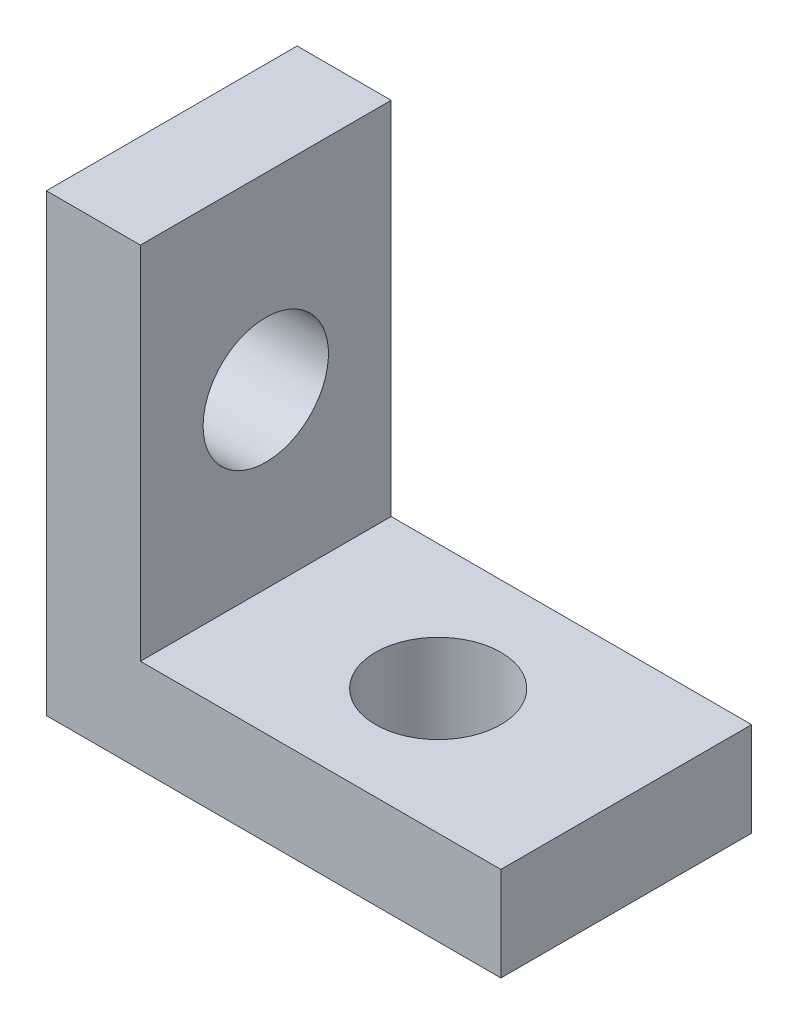
ISO-10303-21;
HEADER;
FILE_DESCRIPTION(('STEP AP214'),'2;1');
FILE_NAME('part.step','',(''),(''),'','','');
FILE_SCHEMA(('AUTOMOTIVE_DESIGN { 1 0 10303 214 1 1 1 1 }'));
ENDSEC;
DATA;
#1=APPLICATION_CONTEXT('core data for automotive mechanical design processes');
#2=APPLICATION_PROTOCOL_DEFINITION('international standard','automotive_design',2000,#1);
#3=PRODUCT_CONTEXT('',#1,'mechanical');
#4=PRODUCT('Part','Part','',(#3));
#5=PRODUCT_RELATED_PRODUCT_CATEGORY('part','',(#4));
#6=PRODUCT_DEFINITION_FORMATION('','',#4);
#7=PRODUCT_DEFINITION_CONTEXT('part definition',#1,'design');
#8=PRODUCT_DEFINITION('design','',#6,#7);
#9=PRODUCT_DEFINITION_SHAPE('','',#8);
#10=(LENGTH_UNIT() NAMED_UNIT(*) SI_UNIT(.MILLI.,.METRE.));
#11=(NAMED_UNIT(*) PLANE_ANGLE_UNIT() SI_UNIT($,.RADIAN.));
#12=(NAMED_UNIT(*) SI_UNIT($,.STERADIAN.) SOLID_ANGLE_UNIT());
#13=UNCERTAINTY_MEASURE_WITH_UNIT(LENGTH_MEASURE(1.E-05),#10,'distance_accuracy_value','');
#14=(GEOMETRIC_REPRESENTATION_CONTEXT(3) GLOBAL_UNCERTAINTY_ASSIGNED_CONTEXT((#13)) GLOBAL_UNIT_ASSIGNED_CONTEXT((#10,
#11,#12)) REPRESENTATION_CONTEXT('',''));
#15=CARTESIAN_POINT('',(0.,0.,0.));
#16=DIRECTION('',(0.,0.,1.));
#17=DIRECTION('',(1.,0.,0.));
#18=AXIS2_PLACEMENT_3D('',#15,#16,#17);
#19=CARTESIAN_POINT('',(0.,0.,8.));
#20=DIRECTION('',(1.,0.,0.));
#21=DIRECTION('',(0.,0.,-1.));
#22=AXIS2_PLACEMENT_3D('',#19,#20,#21);
#23=PLANE('',#22);
#24=CARTESIAN_POINT('',(0.,8.5,4.));
#25=DIRECTION('',(-1.,0.,0.));
#26=DIRECTION('',(0.,0.,1.));
#27=AXIS2_PLACEMENT_3D('',#24,#25,#26);
#28=CIRCLE('',#27,2.);
#29=CARTESIAN_POINT('',(0.,8.5,6.));
#30=VERTEX_POINT('',#29);
#31=EDGE_CURVE('E148',#30,#30,#28,.T.);
#32=ORIENTED_EDGE('',*,*,#31,.F.);
#33=EDGE_LOOP('',(#32));
#34=FACE_BOUND('',#33,.T.);
#35=DIRECTION('',(0.,-1.,0.));
#36=VECTOR('',#35,1.);
#37=CARTESIAN_POINT('',(0.,0.,0.));
#38=LINE('',#37,#36);
#39=CARTESIAN_POINT('',(0.,14.5,0.));
#40=VERTEX_POINT('',#39);
#41=CARTESIAN_POINT('',(0.,0.,0.));
#42=VERTEX_POINT('',#41);
#43=EDGE_CURVE('E123',#40,#42,#38,.T.);
#44=ORIENTED_EDGE('',*,*,#43,.T.);
#45=DIRECTION('',(0.,0.,-1.));
#46=VECTOR('',#45,1.);
#47=CARTESIAN_POINT('',(0.,0.,8.));
#48=LINE('',#47,#46);
#49=CARTESIAN_POINT('',(0.,0.,8.));
#50=VERTEX_POINT('',#49);
#51=EDGE_CURVE('E11',#50,#42,#48,.T.);
#52=ORIENTED_EDGE('',*,*,#51,.F.);
#53=DIRECTION('',(0.,-1.,0.));
#54=VECTOR('',#53,1.);
#55=CARTESIAN_POINT('',(0.,0.,8.));
#56=LINE('',#55,#54);
#57=CARTESIAN_POINT('',(0.,14.5,8.));
#58=VERTEX_POINT('',#57);
#59=EDGE_CURVE('E134',#58,#50,#56,.T.);
#60=ORIENTED_EDGE('',*,*,#59,.F.);
#61=DIRECTION('',(0.,0.,-1.));
#62=VECTOR('',#61,1.);
#63=CARTESIAN_POINT('',(0.,14.5,8.));
#64=LINE('',#63,#62);
#65=EDGE_CURVE('E119',#58,#40,#64,.T.);
#66=ORIENTED_EDGE('',*,*,#65,.T.);
#67=EDGE_LOOP('',(#44,#52,#60,#66));
#68=FACE_BOUND('',#67,.T.);
#69=ADVANCED_FACE('F37',(#34,#68),#23,.F.);
#70=CARTESIAN_POINT('',(0.,0.,8.));
#71=DIRECTION('',(0.,1.,0.));
#72=DIRECTION('',(0.,0.,1.));
#73=AXIS2_PLACEMENT_3D('',#70,#71,#72);
#74=PLANE('',#73);
#75=CARTESIAN_POINT('',(8.5,0.,4.));
#76=DIRECTION('',(0.,-1.,0.));
#77=DIRECTION('',(0.,0.,-1.));
#78=AXIS2_PLACEMENT_3D('',#75,#76,#77);
#79=CIRCLE('',#78,2.);
#80=CARTESIAN_POINT('',(8.5,0.,2.));
#81=VERTEX_POINT('',#80);
#82=EDGE_CURVE('E140',#81,#81,#79,.T.);
#83=ORIENTED_EDGE('',*,*,#82,.F.);
#84=EDGE_LOOP('',(#83));
#85=FACE_BOUND('',#84,.T.);
#86=DIRECTION('',(1.,0.,0.));
#87=VECTOR('',#86,1.);
#88=CARTESIAN_POINT('',(0.,0.,0.));
#89=LINE('',#88,#87);
#90=CARTESIAN_POINT('',(14.5,0.,0.));
#91=VERTEX_POINT('',#90);
#92=EDGE_CURVE('E126',#42,#91,#89,.T.);
#93=ORIENTED_EDGE('',*,*,#92,.T.);
#94=DIRECTION('',(0.,0.,-1.));
#95=VECTOR('',#94,1.);
#96=CARTESIAN_POINT('',(14.5,0.,8.));
#97=LINE('',#96,#95);
#98=CARTESIAN_POINT('',(14.5,0.,8.));
#99=VERTEX_POINT('',#98);
#100=EDGE_CURVE('E46',#99,#91,#97,.T.);
#101=ORIENTED_EDGE('',*,*,#100,.F.);
#102=DIRECTION('',(1.,0.,0.));
#103=VECTOR('',#102,1.);
#104=CARTESIAN_POINT('',(0.,0.,8.));
#105=LINE('',#104,#103);
#106=EDGE_CURVE('E92',#50,#99,#105,.T.);
#107=ORIENTED_EDGE('',*,*,#106,.F.);
#108=ORIENTED_EDGE('',*,*,#51,.T.);
#109=EDGE_LOOP('',(#93,#101,#107,#108));
#110=FACE_BOUND('',#109,.T.);
#111=ADVANCED_FACE('F154',(#85,#110),#74,.F.);
#112=CARTESIAN_POINT('',(14.5,0.,8.));
#113=DIRECTION('',(-1.,0.,0.));
#114=DIRECTION('',(0.,0.,1.));
#115=AXIS2_PLACEMENT_3D('',#112,#113,#114);
#116=PLANE('',#115);
#117=DIRECTION('',(0.,1.,0.));
#118=VECTOR('',#117,1.);
#119=CARTESIAN_POINT('',(14.5,0.,0.));
#120=LINE('',#119,#118);
#121=CARTESIAN_POINT('',(14.5,3.,0.));
#122=VERTEX_POINT('',#121);
#123=EDGE_CURVE('E129',#91,#122,#120,.T.);
#124=ORIENTED_EDGE('',*,*,#123,.T.);
#125=DIRECTION('',(0.,0.,-1.));
#126=VECTOR('',#125,1.);
#127=CARTESIAN_POINT('',(14.5,3.,8.));
#128=LINE('',#127,#126);
#129=CARTESIAN_POINT('',(14.5,3.,8.));
#130=VERTEX_POINT('',#129);
#131=EDGE_CURVE('E114',#130,#122,#128,.T.);
#132=ORIENTED_EDGE('',*,*,#131,.F.);
#133=DIRECTION('',(0.,1.,0.));
#134=VECTOR('',#133,1.);
#135=CARTESIAN_POINT('',(14.5,0.,8.));
#136=LINE('',#135,#134);
#137=EDGE_CURVE('E105',#99,#130,#136,.T.);
#138=ORIENTED_EDGE('',*,*,#137,.F.);
#139=ORIENTED_EDGE('',*,*,#100,.T.);
#140=EDGE_LOOP('',(#124,#132,#138,#139));
#141=FACE_BOUND('',#140,.T.);
#142=ADVANCED_FACE('F157',(#141),#116,.F.);
#143=CARTESIAN_POINT('',(14.5,3.,8.));
#144=DIRECTION('',(0.,-1.,0.));
#145=DIRECTION('',(0.,0.,-1.));
#146=AXIS2_PLACEMENT_3D('',#143,#144,#145);
#147=PLANE('',#146);
#148=CARTESIAN_POINT('',(8.5,3.,4.));
#149=DIRECTION('',(0.,-1.,0.));
#150=DIRECTION('',(0.,0.,-1.));
#151=AXIS2_PLACEMENT_3D('',#148,#149,#150);
#152=CIRCLE('',#151,2.);
#153=CARTESIAN_POINT('',(8.5,3.,2.));
#154=VERTEX_POINT('',#153);
#155=EDGE_CURVE('E127',#154,#154,#152,.T.);
#156=ORIENTED_EDGE('',*,*,#155,.T.);
#157=EDGE_LOOP('',(#156));
#158=FACE_BOUND('',#157,.T.);
#159=DIRECTION('',(-1.,0.,0.));
#160=VECTOR('',#159,1.);
#161=CARTESIAN_POINT('',(14.5,3.,0.));
#162=LINE('',#161,#160);
#163=CARTESIAN_POINT('',(3.,3.,0.));
#164=VERTEX_POINT('',#163);
#165=EDGE_CURVE('E113',#122,#164,#162,.T.);
#166=ORIENTED_EDGE('',*,*,#165,.T.);
#167=DIRECTION('',(0.,0.,-1.));
#168=VECTOR('',#167,1.);
#169=CARTESIAN_POINT('',(3.,3.,8.));
#170=LINE('',#169,#168);
#171=CARTESIAN_POINT('',(3.,3.,8.));
#172=VERTEX_POINT('',#171);
#173=EDGE_CURVE('E110',#172,#164,#170,.T.);
#174=ORIENTED_EDGE('',*,*,#173,.F.);
#175=DIRECTION('',(-1.,0.,0.));
#176=VECTOR('',#175,1.);
#177=CARTESIAN_POINT('',(14.5,3.,8.));
#178=LINE('',#177,#176);
#179=EDGE_CURVE('E99',#130,#172,#178,.T.);
#180=ORIENTED_EDGE('',*,*,#179,.F.);
#181=ORIENTED_EDGE('',*,*,#131,.T.);
#182=EDGE_LOOP('',(#166,#174,#180,#181));
#183=FACE_BOUND('',#182,.T.);
#184=ADVANCED_FACE('F111',(#158,#183),#147,.F.);
#185=CARTESIAN_POINT('',(3.,3.,8.));
#186=DIRECTION('',(-1.,0.,0.));
#187=DIRECTION('',(0.,0.,1.));
#188=AXIS2_PLACEMENT_3D('',#185,#186,#187);
#189=PLANE('',#188);
#190=CARTESIAN_POINT('',(3.,8.5,4.));
#191=DIRECTION('',(-1.,0.,0.));
#192=DIRECTION('',(0.,0.,1.));
#193=AXIS2_PLACEMENT_3D('',#190,#191,#192);
#194=CIRCLE('',#193,2.);
#195=CARTESIAN_POINT('',(3.,8.5,6.));
#196=VERTEX_POINT('',#195);
#197=EDGE_CURVE('E40',#196,#196,#194,.T.);
#198=ORIENTED_EDGE('',*,*,#197,.T.);
#199=EDGE_LOOP('',(#198));
#200=FACE_BOUND('',#199,.T.);
#201=DIRECTION('',(0.,1.,0.));
#202=VECTOR('',#201,1.);
#203=CARTESIAN_POINT('',(3.,3.,0.));
#204=LINE('',#203,#202);
#205=CARTESIAN_POINT('',(3.,14.5,0.));
#206=VERTEX_POINT('',#205);
#207=EDGE_CURVE('E78',#164,#206,#204,.T.);
#208=ORIENTED_EDGE('',*,*,#207,.T.);
#209=DIRECTION('',(0.,0.,-1.));
#210=VECTOR('',#209,1.);
#211=CARTESIAN_POINT('',(3.,14.5,8.));
#212=LINE('',#211,#210);
#213=CARTESIAN_POINT('',(3.,14.5,8.));
#214=VERTEX_POINT('',#213);
#215=EDGE_CURVE('E115',#214,#206,#212,.T.);
#216=ORIENTED_EDGE('',*,*,#215,.F.);
#217=DIRECTION('',(0.,1.,0.));
#218=VECTOR('',#217,1.);
#219=CARTESIAN_POINT('',(3.,3.,8.));
#220=LINE('',#219,#218);
#221=EDGE_CURVE('E103',#172,#214,#220,.T.);
#222=ORIENTED_EDGE('',*,*,#221,.F.);
#223=ORIENTED_EDGE('',*,*,#173,.T.);
#224=EDGE_LOOP('',(#208,#216,#222,#223));
#225=FACE_BOUND('',#224,.T.);
#226=ADVANCED_FACE('F117',(#200,#225),#189,.F.);
#227=CARTESIAN_POINT('',(0.,14.5,8.));
#228=DIRECTION('',(0.,-1.,0.));
#229=DIRECTION('',(0.,0.,-1.));
#230=AXIS2_PLACEMENT_3D('',#227,#228,#229);
#231=PLANE('',#230);
#232=DIRECTION('',(-1.,0.,0.));
#233=VECTOR('',#232,1.);
#234=CARTESIAN_POINT('',(0.,14.5,0.));
#235=LINE('',#234,#233);
#236=EDGE_CURVE('E84',#206,#40,#235,.T.);
#237=ORIENTED_EDGE('',*,*,#236,.T.);
#238=ORIENTED_EDGE('',*,*,#65,.F.);
#239=DIRECTION('',(-1.,0.,0.));
#240=VECTOR('',#239,1.);
#241=CARTESIAN_POINT('',(0.,14.5,8.));
#242=LINE('',#241,#240);
#243=EDGE_CURVE('E55',#214,#58,#242,.T.);
#244=ORIENTED_EDGE('',*,*,#243,.F.);
#245=ORIENTED_EDGE('',*,*,#215,.T.);
#246=EDGE_LOOP('',(#237,#238,#244,#245));
#247=FACE_BOUND('',#246,.T.);
#248=ADVANCED_FACE('F162',(#247),#231,.F.);
#249=CARTESIAN_POINT('',(0.,0.,8.));
#250=DIRECTION('',(0.,0.,-1.));
#251=DIRECTION('',(-1.,0.,0.));
#252=AXIS2_PLACEMENT_3D('',#249,#250,#251);
#253=PLANE('',#252);
#254=ORIENTED_EDGE('',*,*,#59,.T.);
#255=ORIENTED_EDGE('',*,*,#106,.T.);
#256=ORIENTED_EDGE('',*,*,#137,.T.);
#257=ORIENTED_EDGE('',*,*,#179,.T.);
#258=ORIENTED_EDGE('',*,*,#221,.T.);
#259=ORIENTED_EDGE('',*,*,#243,.T.);
#260=EDGE_LOOP('',(#254,#255,#256,#257,#258,#259));
#261=FACE_BOUND('',#260,.T.);
#262=ADVANCED_FACE('F101',(#261),#253,.F.);
#263=CARTESIAN_POINT('',(0.,0.,0.));
#264=DIRECTION('',(0.,0.,-1.));
#265=DIRECTION('',(-1.,0.,0.));
#266=AXIS2_PLACEMENT_3D('',#263,#264,#265);
#267=PLANE('',#266);
#268=ORIENTED_EDGE('',*,*,#43,.F.);
#269=ORIENTED_EDGE('',*,*,#236,.F.);
#270=ORIENTED_EDGE('',*,*,#207,.F.);
#271=ORIENTED_EDGE('',*,*,#165,.F.);
#272=ORIENTED_EDGE('',*,*,#123,.F.);
#273=ORIENTED_EDGE('',*,*,#92,.F.);
#274=EDGE_LOOP('',(#268,#269,#270,#271,#272,#273));
#275=FACE_BOUND('',#274,.T.);
#276=ADVANCED_FACE('F160',(#275),#267,.T.);
#277=CARTESIAN_POINT('',(8.5,14.5,4.));
#278=DIRECTION('',(0.,-1.,0.));
#279=DIRECTION('',(0.,0.,-1.));
#280=AXIS2_PLACEMENT_3D('',#277,#278,#279);
#281=CYLINDRICAL_SURFACE('',#280,2.);
#282=CARTESIAN_POINT('',(8.5,0.,2.));
#283=CARTESIAN_POINT('',(8.5,0.03125,2.));
#284=CARTESIAN_POINT('',(8.5,0.0625000000000001,2.));
#285=CARTESIAN_POINT('',(8.5,0.125,2.));
#286=CARTESIAN_POINT('',(8.5,0.15625,2.));
#287=CARTESIAN_POINT('',(8.5,0.21875,2.));
#288=CARTESIAN_POINT('',(8.5,0.25,2.));
#289=CARTESIAN_POINT('',(8.5,0.3125,2.));
#290=CARTESIAN_POINT('',(8.5,0.34375,2.));
#291=CARTESIAN_POINT('',(8.5,0.40625,2.));
#292=CARTESIAN_POINT('',(8.5,0.4375,2.));
#293=CARTESIAN_POINT('',(8.5,0.5,2.));
#294=CARTESIAN_POINT('',(8.5,0.53125,2.));
#295=CARTESIAN_POINT('',(8.5,0.593750000000001,2.));
#296=CARTESIAN_POINT('',(8.5,0.625000000000001,2.));
#297=CARTESIAN_POINT('',(8.5,0.687500000000001,2.));
#298=CARTESIAN_POINT('',(8.5,0.718750000000001,2.));
#299=CARTESIAN_POINT('',(8.5,0.781250000000001,2.));
#300=CARTESIAN_POINT('',(8.5,0.812500000000001,2.));
#301=CARTESIAN_POINT('',(8.5,0.875000000000001,2.));
#302=CARTESIAN_POINT('',(8.5,0.906250000000001,2.));
#303=CARTESIAN_POINT('',(8.5,0.968750000000001,2.));
#304=CARTESIAN_POINT('',(8.5,1.,2.));
#305=CARTESIAN_POINT('',(8.5,1.0625,2.));
#306=CARTESIAN_POINT('',(8.5,1.09375,2.));
#307=CARTESIAN_POINT('',(8.5,1.15625,2.));
#308=CARTESIAN_POINT('',(8.5,1.1875,2.));
#309=CARTESIAN_POINT('',(8.5,1.25,2.));
#310=CARTESIAN_POINT('',(8.5,1.28125,2.));
#311=CARTESIAN_POINT('',(8.5,1.34375,2.));
#312=CARTESIAN_POINT('',(8.5,1.375,2.));
#313=CARTESIAN_POINT('',(8.5,1.4375,2.));
#314=CARTESIAN_POINT('',(8.5,1.46875,2.));
#315=CARTESIAN_POINT('',(8.5,1.53125,2.));
#316=CARTESIAN_POINT('',(8.5,1.5625,2.));
#317=CARTESIAN_POINT('',(8.5,1.625,2.));
#318=CARTESIAN_POINT('',(8.5,1.65625,2.));
#319=CARTESIAN_POINT('',(8.5,1.71875,2.));
#320=CARTESIAN_POINT('',(8.5,1.75,2.));
#321=CARTESIAN_POINT('',(8.5,1.8125,2.));
#322=CARTESIAN_POINT('',(8.5,1.84375,2.));
#323=CARTESIAN_POINT('',(8.5,1.90625,2.));
#324=CARTESIAN_POINT('',(8.5,1.9375,2.));
#325=CARTESIAN_POINT('',(8.5,2.,2.));
#326=CARTESIAN_POINT('',(8.5,2.03125,2.));
#327=CARTESIAN_POINT('',(8.5,2.09375,2.));
#328=CARTESIAN_POINT('',(8.5,2.125,2.));
#329=CARTESIAN_POINT('',(8.5,2.1875,2.));
#330=CARTESIAN_POINT('',(8.5,2.21875,2.));
#331=CARTESIAN_POINT('',(8.5,2.28125,2.));
#332=CARTESIAN_POINT('',(8.5,2.3125,2.));
#333=CARTESIAN_POINT('',(8.5,2.375,2.));
#334=CARTESIAN_POINT('',(8.5,2.40625,2.));
#335=CARTESIAN_POINT('',(8.5,2.46875,2.));
#336=CARTESIAN_POINT('',(8.5,2.5,2.));
#337=CARTESIAN_POINT('',(8.5,2.5625,2.));
#338=CARTESIAN_POINT('',(8.5,2.59375,2.));
#339=CARTESIAN_POINT('',(8.5,2.65625,2.));
#340=CARTESIAN_POINT('',(8.5,2.6875,2.));
#341=CARTESIAN_POINT('',(8.5,2.75,2.));
#342=CARTESIAN_POINT('',(8.5,2.78125,2.));
#343=CARTESIAN_POINT('',(8.5,2.84375,2.));
#344=CARTESIAN_POINT('',(8.5,2.875,2.));
#345=CARTESIAN_POINT('',(8.5,2.9375,2.));
#346=CARTESIAN_POINT('',(8.5,2.96875,2.));
#347=CARTESIAN_POINT('',(8.5,3.,2.));
#348=B_SPLINE_CURVE_WITH_KNOTS('',3,(#282,#283,#284,#285,#286,#287,#288,#289,#290,#291,#292,
#293,#294,#295,#296,#297,#298,#299,#300,#301,#302,#303,#304,#305,#306,#307,#308,#309,#310,#311,
#312,#313,#314,#315,#316,#317,#318,#319,#320,#321,#322,#323,#324,#325,#326,#327,#328,#329,#330,
#331,#332,#333,#334,#335,#336,#337,#338,#339,#340,#341,#342,#343,#344,#345,#346,#347),
.UNSPECIFIED.,.F.,.F.,(4,2,2,2,2,2,2,2,2,2,2,2,2,2,2,2,2,2,2,2,2,2,2,2,2,2,2,2,2,2,2,2,4),(0.,
0.0937500000000001,0.1875,0.28125,0.375,0.46875,0.5625,0.656250000000001,0.750000000000001,
0.843750000000001,0.937500000000001,1.03125,1.125,1.21875,1.3125,1.40625,1.5,1.59375,1.6875,
1.78125,1.875,1.96875,2.0625,2.15625,2.25,2.34375,2.4375,2.53125,2.625,2.71875,2.8125,2.90625,
3.),.UNSPECIFIED.);
#349=EDGE_CURVE('BSEAM185',#81,#154,#348,.T.);
#350=ORIENTED_EDGE('',*,*,#82,.T.);
#351=ORIENTED_EDGE('',*,*,#155,.F.);
#352=ORIENTED_EDGE('',*,*,#349,.T.);
#353=ORIENTED_EDGE('',*,*,#349,.F.);
#354=EDGE_LOOP('',(#350,#352,#351,#353));
#355=FACE_BOUND('',#354,.T.);
#356=ADVANCED_FACE('F185',(#355),#281,.F.);
#357=CARTESIAN_POINT('',(8.,8.5,4.));
#358=DIRECTION('',(-1.,0.,0.));
#359=DIRECTION('',(0.,0.,1.));
#360=AXIS2_PLACEMENT_3D('',#357,#358,#359);
#361=CYLINDRICAL_SURFACE('',#360,2.);
#362=ORIENTED_EDGE('',*,*,#31,.T.);
#363=EDGE_LOOP('',(#362));
#364=FACE_BOUND('',#363,.T.);
#365=ORIENTED_EDGE('',*,*,#197,.F.);
#366=EDGE_LOOP('',(#365));
#367=FACE_BOUND('',#366,.T.);
#368=ADVANCED_FACE('F182',(#364,#367),#361,.F.);
#369=CLOSED_SHELL('',(#69,#111,#142,#184,#226,#248,#262,#276,#356,#368));
#370=MANIFOLD_SOLID_BREP('B2',#369);
#371=ADVANCED_BREP_SHAPE_REPRESENTATION('',(#18,#370),#14);
#372=SHAPE_DEFINITION_REPRESENTATION(#9,#371);
ENDSEC;
END-ISO-10303-21;
